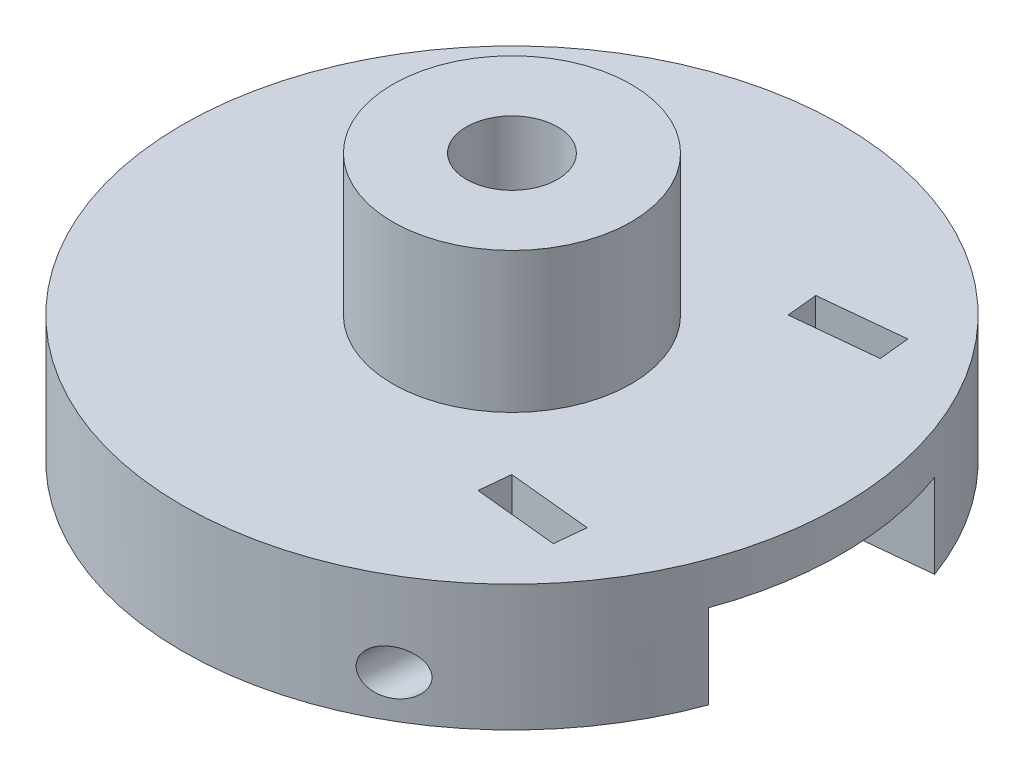
ISO-10303-21;
HEADER;
FILE_DESCRIPTION(('STEP AP214'),'2;1');
FILE_NAME('part.step','',(''),(''),'','','');
FILE_SCHEMA(('AUTOMOTIVE_DESIGN { 1 0 10303 214 1 1 1 1 }'));
ENDSEC;
DATA;
#1=APPLICATION_CONTEXT('core data for automotive mechanical design processes');
#2=APPLICATION_PROTOCOL_DEFINITION('international standard','automotive_design',2000,#1);
#3=PRODUCT_CONTEXT('',#1,'mechanical');
#4=PRODUCT('Part','Part','',(#3));
#5=PRODUCT_RELATED_PRODUCT_CATEGORY('part','',(#4));
#6=PRODUCT_DEFINITION_FORMATION('','',#4);
#7=PRODUCT_DEFINITION_CONTEXT('part definition',#1,'design');
#8=PRODUCT_DEFINITION('design','',#6,#7);
#9=PRODUCT_DEFINITION_SHAPE('','',#8);
#10=(LENGTH_UNIT() NAMED_UNIT(*) SI_UNIT(.MILLI.,.METRE.));
#11=(NAMED_UNIT(*) PLANE_ANGLE_UNIT() SI_UNIT($,.RADIAN.));
#12=(NAMED_UNIT(*) SI_UNIT($,.STERADIAN.) SOLID_ANGLE_UNIT());
#13=UNCERTAINTY_MEASURE_WITH_UNIT(LENGTH_MEASURE(1.E-05),#10,'distance_accuracy_value','');
#14=(GEOMETRIC_REPRESENTATION_CONTEXT(3) GLOBAL_UNCERTAINTY_ASSIGNED_CONTEXT((#13)) GLOBAL_UNIT_ASSIGNED_CONTEXT((#10,
#11,#12)) REPRESENTATION_CONTEXT('',''));
#15=CARTESIAN_POINT('',(0.,0.,0.));
#16=DIRECTION('',(0.,0.,1.));
#17=DIRECTION('',(1.,0.,0.));
#18=AXIS2_PLACEMENT_3D('',#15,#16,#17);
#19=CARTESIAN_POINT('',(0.,3.,0.));
#20=DIRECTION('',(0.,-1.,0.));
#21=DIRECTION('',(0.,0.,-1.));
#22=AXIS2_PLACEMENT_3D('',#19,#20,#21);
#23=CYLINDRICAL_SURFACE('',#22,23.5);
#24=CARTESIAN_POINT('',(13.5222011775975,3.,-19.2197834356316));
#25=CARTESIAN_POINT('',(13.5221980120531,3.07483103153542,-19.2197859059042));
#26=CARTESIAN_POINT('',(13.5164843273736,3.14968338715381,-19.2238094203284));
#27=CARTESIAN_POINT('',(13.4940682696431,3.29689340878573,-19.2395503963883));
#28=CARTESIAN_POINT('',(13.4773582109543,3.36924929270162,-19.2512732392639));
#29=CARTESIAN_POINT('',(13.4342418699253,3.50900694647206,-19.2813853924618));
#30=CARTESIAN_POINT('',(13.4078926114762,3.57643510915319,-19.2997354890764));
#31=CARTESIAN_POINT('',(13.3469422633825,3.70555338273323,-19.3419364574035));
#32=CARTESIAN_POINT('',(13.3123372158487,3.76724072165857,-19.3657899673138));
#33=CARTESIAN_POINT('',(13.2227421340463,3.90506966432966,-19.4271194263085));
#34=CARTESIAN_POINT('',(13.1648814625502,3.97853404739126,-19.4664213022093));
#35=CARTESIAN_POINT('',(13.0396310709168,4.11316767956063,-19.5505432513236));
#36=CARTESIAN_POINT('',(12.9722236279675,4.17431353701327,-19.595373567166));
#37=CARTESIAN_POINT('',(12.8120949412412,4.29833168697844,-19.7005469366235));
#38=CARTESIAN_POINT('',(12.7173062621429,4.35765389980114,-19.761927068992));
#39=CARTESIAN_POINT('',(12.5199685850539,4.45709571930429,-19.887536462409));
#40=CARTESIAN_POINT('',(12.417416112908,4.49720666977237,-19.9517669935749));
#41=CARTESIAN_POINT('',(12.2062526908605,4.55856474508014,-20.0816557410415));
#42=CARTESIAN_POINT('',(12.0975931911652,4.5796278496408,-20.1473217359174));
#43=CARTESIAN_POINT('',(11.8776654414834,4.60186585169948,-20.2777567860175));
#44=CARTESIAN_POINT('',(11.7663961430286,4.60303261403563,-20.3425254635347));
#45=CARTESIAN_POINT('',(11.5358853535261,4.58407912645943,-20.4741838748625));
#46=CARTESIAN_POINT('',(11.4166558097744,4.56239621251844,-20.5408824399028));
#47=CARTESIAN_POINT('',(11.1826629020384,4.49415963803995,-20.6691987775772));
#48=CARTESIAN_POINT('',(11.0678932521617,4.44764245261168,-20.7308238490366));
#49=CARTESIAN_POINT('',(10.877421079741,4.34480600579831,-20.8312287536999));
#50=CARTESIAN_POINT('',(10.7994359553942,4.29436753985028,-20.8717302209751));
#51=CARTESIAN_POINT('',(10.6514261597967,4.17974334143819,-20.9476494317502));
#52=CARTESIAN_POINT('',(10.5813977507641,4.11556410511116,-20.9830695643513));
#53=CARTESIAN_POINT('',(10.4518859832309,3.97358934871259,-21.0478830293301));
#54=CARTESIAN_POINT('',(10.392488578776,3.89569213135531,-21.077227513115));
#55=CARTESIAN_POINT('',(10.2883678347045,3.72838034792822,-21.1282481751348));
#56=CARTESIAN_POINT('',(10.2436312278912,3.63897629752473,-21.1499312878763));
#57=CARTESIAN_POINT('',(10.1768640488557,3.46459605693984,-21.1821298469724));
#58=CARTESIAN_POINT('',(10.1525599181714,3.38069607325822,-21.1937695404374));
#59=CARTESIAN_POINT('',(10.1186429937942,3.20933114518323,-21.2099842151759));
#60=CARTESIAN_POINT('',(10.1090189079939,3.12186899408871,-21.2145646265816));
#61=CARTESIAN_POINT('',(10.1052585413638,2.95563234261322,-21.2163555788096));
#62=CARTESIAN_POINT('',(10.1096235788057,2.87689474292144,-21.2142792587364));
#63=CARTESIAN_POINT('',(10.1303887452489,2.72140998130758,-21.2043711341311));
#64=CARTESIAN_POINT('',(10.1467868506259,2.64466248695226,-21.1965402973469));
#65=CARTESIAN_POINT('',(10.1905210107242,2.49618338573029,-21.1755485023078));
#66=CARTESIAN_POINT('',(10.2177213552963,2.42440205625921,-21.1624536525756));
#67=CARTESIAN_POINT('',(10.2818355084101,2.28647742941954,-21.1313776753956));
#68=CARTESIAN_POINT('',(10.3187513071461,2.22033529090925,-21.1133955467722));
#69=CARTESIAN_POINT('',(10.4036815301208,2.09057273702578,-21.0716822187427));
#70=CARTESIAN_POINT('',(10.4522851048477,2.02743948299099,-21.0476404353167));
#71=CARTESIAN_POINT('',(10.557102883814,1.90990511195087,-20.9952616570003));
#72=CARTESIAN_POINT('',(10.6133202420087,1.85550763419821,-20.9669228815268));
#73=CARTESIAN_POINT('',(10.739210032997,1.74952557108295,-20.9027501514253));
#74=CARTESIAN_POINT('',(10.8096835056405,1.69919484459612,-20.8664210802634));
#75=CARTESIAN_POINT('',(10.9558703118088,1.61040675416156,-20.7900390073905));
#76=CARTESIAN_POINT('',(11.0315865179262,1.57195596348854,-20.7499839599528));
#77=CARTESIAN_POINT('',(11.1988874139172,1.501514902044,-20.6602348675091));
#78=CARTESIAN_POINT('',(11.2910594307316,1.47157217205741,-20.6100290745997));
#79=CARTESIAN_POINT('',(11.4774828075424,1.42702914044929,-20.5067981908008));
#80=CARTESIAN_POINT('',(11.5717352089896,1.41243670966324,-20.453771668212));
#81=CARTESIAN_POINT('',(11.7751179906376,1.39694111646435,-20.3374617788052));
#82=CARTESIAN_POINT('',(11.8842675595839,1.39853867652308,-20.2738722849495));
#83=CARTESIAN_POINT('',(12.1001505110611,1.4209053664837,-20.1457725660885));
#84=CARTESIAN_POINT('',(12.2068810793826,1.44169575870277,-20.0812613980774));
#85=CARTESIAN_POINT('',(12.4249116815316,1.50488719076168,-19.9471648244703));
#86=CARTESIAN_POINT('',(12.5357429270975,1.54908356244745,-19.8776522275385));
#87=CARTESIAN_POINT('',(12.7479628730855,1.65999308287782,-19.7422193163887));
#88=CARTESIAN_POINT('',(12.8493634479151,1.72667741300555,-19.6762945292955));
#89=CARTESIAN_POINT('',(13.0102986676335,1.85977223384235,-19.5700930749087));
#90=CARTESIAN_POINT('',(13.0733642826178,1.92047098660164,-19.527983697724));
#91=CARTESIAN_POINT('',(13.1903361679585,2.05316867833011,-19.4491639495869));
#92=CARTESIAN_POINT('',(13.2442561620898,2.12515036829323,-19.4124455004238));
#93=CARTESIAN_POINT('',(13.3310254590755,2.26500579652732,-19.3529323772489));
#94=CARTESIAN_POINT('',(13.3659322480568,2.3310362230379,-19.3288177968167));
#95=CARTESIAN_POINT('',(13.4262527520051,2.46918448592296,-19.2869668377324));
#96=CARTESIAN_POINT('',(13.4516779807111,2.54129480790879,-19.2692227242168));
#97=CARTESIAN_POINT('',(13.4881234583805,2.67756028491129,-19.2437246251107));
#98=CARTESIAN_POINT('',(13.5008361559049,2.74104398154278,-19.2347999707469));
#99=CARTESIAN_POINT('',(13.5178757456202,2.86967990098326,-19.2228287547821));
#100=CARTESIAN_POINT('',(13.5222039343767,2.93483186423539,-19.2197812843442));
#101=CARTESIAN_POINT('',(13.5222011775975,3.,-19.2197834356316));
#102=B_SPLINE_CURVE_WITH_KNOTS('',3,(#24,#25,#26,#27,#28,#29,#30,#31,#32,#33,#34,#35,#36,#37,
#38,#39,#40,#41,#42,#43,#44,#45,#46,#47,#48,#49,#50,#51,#52,#53,#54,#55,#56,#57,#58,#59,#60,#61,
#62,#63,#64,#65,#66,#67,#68,#69,#70,#71,#72,#73,#74,#75,#76,#77,#78,#79,#80,#81,#82,#83,#84,#85,
#86,#87,#88,#89,#90,#91,#92,#93,#94,#95,#96,#97,#98,#99,#100,#101),.UNSPECIFIED.,.T.,.F.,(4,2,2,
2,2,2,2,2,2,2,2,2,2,2,2,2,2,2,2,2,2,2,2,2,2,2,2,2,2,2,2,2,2,2,2,2,2,2,4),(0.,0.224218629152609,
0.448594136928393,0.671663192612257,0.89483940498668,1.19750369238872,1.50073740156501,
1.88144287518918,2.26231972611965,2.64683807448197,3.03151363988453,3.4443152405295,
3.85651220389316,4.1592788034945,4.46190258087415,4.76687231238662,5.07156529643331,
5.33444256297361,5.59711751828331,5.83262917451993,6.06810123338029,6.30070413705708,
6.53335472618018,6.78202342105378,7.03079544202725,7.31144831541638,7.59225619959714,
7.91843364694605,8.24477825973386,8.62221279436888,9.00006596319255,9.4123234444621,
9.82405460736911,10.1144377133002,10.4043811440437,10.6389210079912,10.8731751285977,
11.0684707146054,11.26373609804),.UNSPECIFIED.);
#103=CARTESIAN_POINT('',(13.5222011775975,3.,-19.2197834356316));
#104=VERTEX_POINT('',#103);
#105=EDGE_CURVE('E185',#104,#104,#102,.T.);
#106=ORIENTED_EDGE('',*,*,#105,.T.);
#107=EDGE_LOOP('',(#106));
#108=FACE_BOUND('',#107,.T.);
#109=DIRECTION('',(0.,-1.,0.));
#110=VECTOR('',#109,1.);
#111=CARTESIAN_POINT('',(22.0752847575931,3.,8.05802723197052));
#112=LINE('',#111,#110);
#113=CARTESIAN_POINT('',(22.0752847575931,6.,8.05802723197052));
#114=VERTEX_POINT('',#113);
#115=CARTESIAN_POINT('',(22.0752847575931,0.,8.05802723197052));
#116=VERTEX_POINT('',#115);
#117=EDGE_CURVE('E271',#114,#116,#112,.T.);
#118=ORIENTED_EDGE('',*,*,#117,.F.);
#119=CARTESIAN_POINT('',(0.,6.,0.));
#120=DIRECTION('',(0.,-1.,0.));
#121=DIRECTION('',(0.,0.,-1.));
#122=AXIS2_PLACEMENT_3D('',#119,#120,#121);
#123=CIRCLE('',#122,23.5);
#124=CARTESIAN_POINT('',(22.0752847575931,6.,-8.05802723197051));
#125=VERTEX_POINT('',#124);
#126=EDGE_CURVE('E216',#125,#114,#123,.T.);
#127=ORIENTED_EDGE('',*,*,#126,.F.);
#128=DIRECTION('',(0.,-1.,0.));
#129=VECTOR('',#128,1.);
#130=CARTESIAN_POINT('',(22.0752847575931,3.,-8.05802723197051));
#131=LINE('',#130,#129);
#132=CARTESIAN_POINT('',(22.0752847575931,0.,-8.05802723197051));
#133=VERTEX_POINT('',#132);
#134=EDGE_CURVE('E286',#125,#133,#131,.T.);
#135=ORIENTED_EDGE('',*,*,#134,.T.);
#136=CARTESIAN_POINT('',(0.,0.,0.));
#137=DIRECTION('',(0.,1.,0.));
#138=DIRECTION('',(0.,0.,1.));
#139=AXIS2_PLACEMENT_3D('',#136,#137,#138);
#140=CIRCLE('',#139,23.5);
#141=EDGE_CURVE('E247',#133,#116,#140,.T.);
#142=ORIENTED_EDGE('',*,*,#141,.T.);
#143=EDGE_LOOP('',(#118,#127,#135,#142));
#144=FACE_BOUND('',#143,.T.);
#145=CARTESIAN_POINT('',(0.,9.,0.));
#146=DIRECTION('',(0.,1.,0.));
#147=DIRECTION('',(0.,0.,1.));
#148=AXIS2_PLACEMENT_3D('',#145,#146,#147);
#149=CIRCLE('',#148,23.5);
#150=CARTESIAN_POINT('',(0.,9.,23.5));
#151=VERTEX_POINT('',#150);
#152=EDGE_CURVE('E241',#151,#151,#149,.T.);
#153=ORIENTED_EDGE('',*,*,#152,.F.);
#154=EDGE_LOOP('',(#153));
#155=FACE_BOUND('',#154,.T.);
#156=CARTESIAN_POINT('',(10.1066500326608,3.,21.2156928974125));
#157=CARTESIAN_POINT('',(10.1066596206851,2.92001526048397,21.2156890064881));
#158=CARTESIAN_POINT('',(10.113022143271,2.83991124722057,21.2126610681218));
#159=CARTESIAN_POINT('',(10.1381783155469,2.68201126766179,21.200649107959));
#160=CARTESIAN_POINT('',(10.1570033579199,2.60422164966788,21.1916500449626));
#161=CARTESIAN_POINT('',(10.2060349567702,2.45354127886759,21.1680793055541));
#162=CARTESIAN_POINT('',(10.2362003542757,2.3806339203224,21.1535277785671));
#163=CARTESIAN_POINT('',(10.3065004105874,2.24116844007799,21.119364780268));
#164=CARTESIAN_POINT('',(10.3466314433062,2.17460802115156,21.0997551492931));
#165=CARTESIAN_POINT('',(10.4374576455816,2.04587145103915,21.0549794116021));
#166=CARTESIAN_POINT('',(10.4885775136472,1.98407558528717,21.0295862503547));
#167=CARTESIAN_POINT('',(10.5981523116231,1.86955512572515,20.9745781298752));
#168=CARTESIAN_POINT('',(10.6566106488958,1.81683477295369,20.9449612086125));
#169=CARTESIAN_POINT('',(10.7873784867031,1.71436990699722,20.8779441492551));
#170=CARTESIAN_POINT('',(10.860492395863,1.6659888074044,20.840033055846));
#171=CARTESIAN_POINT('',(11.0116381943955,1.58149356363988,20.7605667410307));
#172=CARTESIAN_POINT('',(11.0896728723233,1.54538645044712,20.7190094480399));
#173=CARTESIAN_POINT('',(11.2617596426314,1.48032015210923,20.626046788733));
#174=CARTESIAN_POINT('',(11.3563467925582,1.45349037586628,20.5741412958097));
#175=CARTESIAN_POINT('',(11.5471434640614,1.41561325564686,20.4676682901979));
#176=CARTESIAN_POINT('',(11.6433537651749,1.40457372682014,20.4130994731435));
#177=CARTESIAN_POINT('',(11.8500481797417,1.39721173613163,20.2939065787517));
#178=CARTESIAN_POINT('',(11.9604728984469,1.40338875660012,20.2290175547076));
#179=CARTESIAN_POINT('',(12.1782441564667,1.43538070797875,20.0986694483679));
#180=CARTESIAN_POINT('',(12.2855868030733,1.46121942947825,20.0332097705113));
#181=CARTESIAN_POINT('',(12.5026708734831,1.53506707666085,19.8985115794719));
#182=CARTESIAN_POINT('',(12.6119487447357,1.58464501684839,19.82937549123));
#183=CARTESIAN_POINT('',(12.8200355956084,1.70651120267432,19.695479634954));
#184=CARTESIAN_POINT('',(12.918862180801,1.77876041589417,19.6307125760155));
#185=CARTESIAN_POINT('',(13.0715311594699,1.91902472602139,19.5292242590454));
#186=CARTESIAN_POINT('',(13.129576852574,1.98083359559236,19.4902130722104));
#187=CARTESIAN_POINT('',(13.2364941564236,2.11478945726003,19.4177591136253));
#188=CARTESIAN_POINT('',(13.2853803130267,2.18691973146527,19.3843075226364));
#189=CARTESIAN_POINT('',(13.3637114115076,2.32696455738424,19.330366577111));
#190=CARTESIAN_POINT('',(13.3950700177297,2.39332205950562,19.3086287801433));
#191=CARTESIAN_POINT('',(13.4482916295975,2.5314636292572,19.2715984802951));
#192=CARTESIAN_POINT('',(13.4701599819397,2.60324461452608,19.2563023484013));
#193=CARTESIAN_POINT('',(13.5030697719909,2.75093590402418,19.2332400857966));
#194=CARTESIAN_POINT('',(13.5140440564513,2.82686881269362,19.2255206627018));
#195=CARTESIAN_POINT('',(13.5240457006154,2.97990017898132,19.2184867023487));
#196=CARTESIAN_POINT('',(13.5230778902018,3.05699815279854,19.2191687671772));
#197=CARTESIAN_POINT('',(13.5100093864646,3.20172640134352,19.2283564544404));
#198=CARTESIAN_POINT('',(13.4990584320354,3.26951796990707,19.2360540853458));
#199=CARTESIAN_POINT('',(13.4683229763311,3.40202858370362,19.2575861684079));
#200=CARTESIAN_POINT('',(13.4485375440477,3.46674730431361,19.2714212673514));
#201=CARTESIAN_POINT('',(13.400213056304,3.59438182116444,19.3050559172674));
#202=CARTESIAN_POINT('',(13.3713470255297,3.65711357029571,19.3250776588803));
#203=CARTESIAN_POINT('',(13.3064995245465,3.77696731627098,19.3697863860376));
#204=CARTESIAN_POINT('',(13.2705131048183,3.83408536935554,19.3944766162053));
#205=CARTESIAN_POINT('',(13.1745905443979,3.96735297977473,19.459827521351));
#206=CARTESIAN_POINT('',(13.1112832341051,4.04005831097235,19.5025873553785));
#207=CARTESIAN_POINT('',(12.9752370247248,4.17213588398953,19.593364619898));
#208=CARTESIAN_POINT('',(12.9024825875604,4.23148570996125,19.6413906912866));
#209=CARTESIAN_POINT('',(12.7487790027911,4.3377394888014,19.7415089067483));
#210=CARTESIAN_POINT('',(12.6677179214348,4.38443047273176,19.7936535732468));
#211=CARTESIAN_POINT('',(12.500379528208,4.46423756438954,19.8997573504992));
#212=CARTESIAN_POINT('',(12.414103349664,4.497356609439,19.9537160659071));
#213=CARTESIAN_POINT('',(12.2188616050059,4.55575916669666,20.0739933446331));
#214=CARTESIAN_POINT('',(12.1090145932496,4.57781388454035,20.1404685240602));
#215=CARTESIAN_POINT('',(11.8864928512322,4.60157546970685,20.2725939996571));
#216=CARTESIAN_POINT('',(11.7738148646627,4.60325771890807,20.338243202086));
#217=CARTESIAN_POINT('',(11.5418355615462,4.58495576828542,20.4708305718348));
#218=CARTESIAN_POINT('',(11.422540851695,4.56367072650159,20.5376113033229));
#219=CARTESIAN_POINT('',(11.1883680162369,4.49624218233628,20.6661118341097));
#220=CARTESIAN_POINT('',(11.0734828186445,4.45014043285303,20.7278399338299));
#221=CARTESIAN_POINT('',(10.8825838303911,4.34795444768724,20.8285334499888));
#222=CARTESIAN_POINT('',(10.8043198323822,4.29772625957088,20.8692038447378));
#223=CARTESIAN_POINT('',(10.6557176799672,4.18346417246775,20.9454681017118));
#224=CARTESIAN_POINT('',(10.5853760557341,4.11943635350096,20.9810641882024));
#225=CARTESIAN_POINT('',(10.4552157163836,3.97770515447492,21.0462304955525));
#226=CARTESIAN_POINT('',(10.3954824552351,3.89989998786941,21.0757520611772));
#227=CARTESIAN_POINT('',(10.2906776710473,3.73266305799192,21.1271243725162));
#228=CARTESIAN_POINT('',(10.2455938734444,3.64324111664787,21.1489815413345));
#229=CARTESIAN_POINT('',(10.1815233268915,3.47739692112737,21.1798852970892));
#230=CARTESIAN_POINT('',(10.1589257006316,3.40268144606029,21.1907187264617));
#231=CARTESIAN_POINT('',(10.1254168835339,3.25022438680251,21.2067510793465));
#232=CARTESIAN_POINT('',(10.1144717579537,3.17249227681174,21.2119663647057));
#233=CARTESIAN_POINT('',(10.1076278493564,3.0629827776036,21.2152269187387));
#234=CARTESIAN_POINT('',(10.1066462565793,3.0315006387504,21.2156944297873));
#235=CARTESIAN_POINT('',(10.1066500326608,3.,21.2156928974125));
#236=B_SPLINE_CURVE_WITH_KNOTS('',3,(#156,#157,#158,#159,#160,#161,#162,#163,#164,#165,#166,
#167,#168,#169,#170,#171,#172,#173,#174,#175,#176,#177,#178,#179,#180,#181,#182,#183,#184,#185,
#186,#187,#188,#189,#190,#191,#192,#193,#194,#195,#196,#197,#198,#199,#200,#201,#202,#203,#204,
#205,#206,#207,#208,#209,#210,#211,#212,#213,#214,#215,#216,#217,#218,#219,#220,#221,#222,#223,
#224,#225,#226,#227,#228,#229,#230,#231,#232,#233,#234,#235),.UNSPECIFIED.,.T.,.F.,(4,2,2,2,2,2,
2,2,2,2,2,2,2,2,2,2,2,2,2,2,2,2,2,2,2,2,2,2,2,2,2,2,2,2,2,2,2,2,2,4),(0.,0.239858132738747,
0.480322771054226,0.719922957090264,0.959436089822438,1.21080893120962,1.46229892353484,
1.74775243729408,2.03336919457755,2.36561642835766,2.69802804616547,3.08110286898564,
3.46464194951312,3.87803242189458,4.29071504213131,4.56975007103254,4.84833814957313,
5.07705202849147,5.3056368849151,5.53562219426412,5.76551449098538,5.97187426764278,
6.17825579635414,6.39313765465092,6.60816940955738,6.92283368436173,7.2380222158833,
7.55822390145191,7.8783562503664,8.26750868484173,8.65713132484391,9.07003865516873,
9.48225345047408,9.78555273109924,10.0887186523888,10.3942256638528,10.6994760315652,
10.9348860009517,11.1696085115447,11.2640725860227),.UNSPECIFIED.);
#237=CARTESIAN_POINT('',(10.1066500326608,3.,21.2156928974125));
#238=VERTEX_POINT('',#237);
#239=EDGE_CURVE('E326',#238,#238,#236,.T.);
#240=ORIENTED_EDGE('',*,*,#239,.F.);
#241=EDGE_LOOP('',(#240));
#242=FACE_BOUND('',#241,.T.);
#243=ADVANCED_FACE('F38',(#108,#144,#155,#242),#23,.T.);
#244=CARTESIAN_POINT('',(0.,0.,0.));
#245=DIRECTION('',(0.,1.,0.));
#246=DIRECTION('',(0.,0.,1.));
#247=AXIS2_PLACEMENT_3D('',#244,#245,#246);
#248=CYLINDRICAL_SURFACE('',#247,3.25);
#249=CARTESIAN_POINT('',(0.,19.,0.));
#250=DIRECTION('',(0.,1.,0.));
#251=DIRECTION('',(0.,0.,1.));
#252=AXIS2_PLACEMENT_3D('',#249,#250,#251);
#253=CIRCLE('',#252,3.25);
#254=CARTESIAN_POINT('',(0.,19.,3.25));
#255=VERTEX_POINT('',#254);
#256=EDGE_CURVE('E233',#255,#255,#253,.T.);
#257=ORIENTED_EDGE('',*,*,#256,.T.);
#258=EDGE_LOOP('',(#257));
#259=FACE_BOUND('',#258,.T.);
#260=CARTESIAN_POINT('',(0.,6.,0.));
#261=DIRECTION('',(0.,-1.,0.));
#262=DIRECTION('',(0.,0.,-1.));
#263=AXIS2_PLACEMENT_3D('',#260,#261,#262);
#264=CIRCLE('',#263,3.25);
#265=CARTESIAN_POINT('',(0.,6.,-3.25));
#266=VERTEX_POINT('',#265);
#267=EDGE_CURVE('E232',#266,#266,#264,.F.);
#268=ORIENTED_EDGE('',*,*,#267,.F.);
#269=EDGE_LOOP('',(#268));
#270=FACE_BOUND('',#269,.T.);
#271=ADVANCED_FACE('F387',(#259,#270),#248,.F.);
#272=CARTESIAN_POINT('',(0.,0.,0.));
#273=DIRECTION('',(0.,1.,0.));
#274=DIRECTION('',(0.,0.,1.));
#275=AXIS2_PLACEMENT_3D('',#272,#273,#274);
#276=PLANE('',#275);
#277=DIRECTION('',(0.995037190209989,0.,0.099503719021001));
#278=VECTOR('',#277,1.);
#279=CARTESIAN_POINT('',(9.83632731801023,0.,9.84909417434851));
#280=LINE('',#279,#278);
#281=CARTESIAN_POINT('',(9.83632731801023,0.,9.84909417434851));
#282=VERTEX_POINT('',#281);
#283=CARTESIAN_POINT('',(15.8065504592702,0.,10.4461164884745));
#284=VERTEX_POINT('',#283);
#285=EDGE_CURVE('E159',#282,#284,#280,.T.);
#286=ORIENTED_EDGE('',*,*,#285,.F.);
#287=DIRECTION('',(0.0995037190209992,0.,-0.995037190209989));
#288=VECTOR('',#287,1.);
#289=CARTESIAN_POINT('',(9.61741913616403,0.,12.0381759928105));
#290=LINE('',#289,#288);
#291=CARTESIAN_POINT('',(9.61741913616403,0.,12.0381759928105));
#292=VERTEX_POINT('',#291);
#293=EDGE_CURVE('E56',#292,#282,#290,.T.);
#294=ORIENTED_EDGE('',*,*,#293,.F.);
#295=DIRECTION('',(-0.995037190209989,0.,-0.0995037190209989));
#296=VECTOR('',#295,1.);
#297=CARTESIAN_POINT('',(15.587642277424,0.,12.6351983069365));
#298=LINE('',#297,#296);
#299=CARTESIAN_POINT('',(15.587642277424,0.,12.6351983069365));
#300=VERTEX_POINT('',#299);
#301=EDGE_CURVE('E167',#300,#292,#298,.T.);
#302=ORIENTED_EDGE('',*,*,#301,.F.);
#303=DIRECTION('',(-0.0995037190209973,0.,0.995037190209989));
#304=VECTOR('',#303,1.);
#305=CARTESIAN_POINT('',(15.8065504592702,0.,10.4461164884745));
#306=LINE('',#305,#304);
#307=EDGE_CURVE('E148',#284,#300,#306,.T.);
#308=ORIENTED_EDGE('',*,*,#307,.F.);
#309=EDGE_LOOP('',(#286,#294,#302,#308));
#310=FACE_BOUND('',#309,.T.);
#311=DIRECTION('',(0.0995037190209968,0.,0.995037190209989));
#312=VECTOR('',#311,1.);
#313=CARTESIAN_POINT('',(15.8065504592702,0.,-10.4461164884745));
#314=LINE('',#313,#312);
#315=CARTESIAN_POINT('',(15.587642277424,0.,-12.6351983069365));
#316=VERTEX_POINT('',#315);
#317=CARTESIAN_POINT('',(15.8065504592702,0.,-10.4461164884745));
#318=VERTEX_POINT('',#317);
#319=EDGE_CURVE('E184',#316,#318,#314,.T.);
#320=ORIENTED_EDGE('',*,*,#319,.F.);
#321=DIRECTION('',(0.995037190209989,0.,-0.0995037190209989));
#322=VECTOR('',#321,1.);
#323=CARTESIAN_POINT('',(15.587642277424,0.,-12.6351983069365));
#324=LINE('',#323,#322);
#325=CARTESIAN_POINT('',(9.61741913616403,0.,-12.0381759928105));
#326=VERTEX_POINT('',#325);
#327=EDGE_CURVE('E64',#326,#316,#324,.T.);
#328=ORIENTED_EDGE('',*,*,#327,.F.);
#329=DIRECTION('',(-0.0995037190209992,0.,-0.995037190209989));
#330=VECTOR('',#329,1.);
#331=CARTESIAN_POINT('',(9.61741913616403,0.,-12.0381759928105));
#332=LINE('',#331,#330);
#333=CARTESIAN_POINT('',(9.83632731801023,0.,-9.84909417434851));
#334=VERTEX_POINT('',#333);
#335=EDGE_CURVE('E193',#334,#326,#332,.T.);
#336=ORIENTED_EDGE('',*,*,#335,.F.);
#337=DIRECTION('',(-0.995037190209989,0.,0.099503719020999));
#338=VECTOR('',#337,1.);
#339=CARTESIAN_POINT('',(9.83632731801023,0.,-9.84909417434851));
#340=LINE('',#339,#338);
#341=EDGE_CURVE('E189',#318,#334,#340,.T.);
#342=ORIENTED_EDGE('',*,*,#341,.F.);
#343=EDGE_LOOP('',(#320,#328,#336,#342));
#344=FACE_BOUND('',#343,.T.);
#345=DIRECTION('',(-0.995037190209989,0.,0.0995037190209987));
#346=VECTOR('',#345,1.);
#347=CARTESIAN_POINT('',(-0.579257302595168,0.,-5.79257302595169));
#348=LINE('',#347,#346);
#349=CARTESIAN_POINT('',(-15.7089578099441,0.,-4.2796029752168));
#350=VERTEX_POINT('',#349);
#351=EDGE_CURVE('E251',#133,#350,#348,.T.);
#352=ORIENTED_EDGE('',*,*,#351,.T.);
#353=CARTESIAN_POINT('',(-15.5,0.,-2.19002487577582));
#354=DIRECTION('',(0.,1.,0.));
#355=DIRECTION('',(0.,0.,1.));
#356=AXIS2_PLACEMENT_3D('',#353,#354,#355);
#357=CIRCLE('',#356,2.10000000000001);
#358=CARTESIAN_POINT('',(-17.6,0.,-2.19002487577583));
#359=VERTEX_POINT('',#358);
#360=EDGE_CURVE('E255',#350,#359,#357,.T.);
#361=ORIENTED_EDGE('',*,*,#360,.T.);
#362=DIRECTION('',(0.,0.,1.));
#363=VECTOR('',#362,1.);
#364=CARTESIAN_POINT('',(-17.6,0.,0.));
#365=LINE('',#364,#363);
#366=CARTESIAN_POINT('',(-17.6,0.,2.19002487577582));
#367=VERTEX_POINT('',#366);
#368=EDGE_CURVE('E259',#359,#367,#365,.T.);
#369=ORIENTED_EDGE('',*,*,#368,.T.);
#370=CARTESIAN_POINT('',(-15.5,0.,2.19002487577583));
#371=DIRECTION('',(0.,1.,0.));
#372=DIRECTION('',(0.,0.,1.));
#373=AXIS2_PLACEMENT_3D('',#370,#371,#372);
#374=CIRCLE('',#373,2.1);
#375=CARTESIAN_POINT('',(-15.7089578099441,0.,4.27960297521681));
#376=VERTEX_POINT('',#375);
#377=EDGE_CURVE('E263',#367,#376,#374,.T.);
#378=ORIENTED_EDGE('',*,*,#377,.T.);
#379=DIRECTION('',(0.995037190209989,0.,0.0995037190209988));
#380=VECTOR('',#379,1.);
#381=CARTESIAN_POINT('',(-0.579257302595169,0.,5.7925730259517));
#382=LINE('',#381,#380);
#383=EDGE_CURVE('E267',#376,#116,#382,.T.);
#384=ORIENTED_EDGE('',*,*,#383,.T.);
#385=ORIENTED_EDGE('',*,*,#141,.F.);
#386=EDGE_LOOP('',(#352,#361,#369,#378,#384,#385));
#387=FACE_BOUND('',#386,.T.);
#388=ADVANCED_FACE('F164',(#310,#344,#387),#276,.F.);
#389=CARTESIAN_POINT('',(-0.579257302595168,3.,-5.79257302595169));
#390=DIRECTION('',(0.0995037190209987,0.,0.995037190209989));
#391=DIRECTION('',(0.995037190209989,0.,-0.0995037190209987));
#392=AXIS2_PLACEMENT_3D('',#389,#390,#391);
#393=PLANE('',#392);
#394=CARTESIAN_POINT('',(13.1199500457032,3.,-7.16249376078153));
#395=DIRECTION('',(0.0995037190209987,0.,0.995037190209989));
#396=DIRECTION('',(0.995037190209989,0.,-0.0995037190209987));
#397=AXIS2_PLACEMENT_3D('',#394,#395,#396);
#398=CIRCLE('',#397,1.6);
#399=CARTESIAN_POINT('',(14.7120095500392,3.,-7.32169971121513));
#400=VERTEX_POINT('',#399);
#401=EDGE_CURVE('E318',#400,#400,#398,.T.);
#402=ORIENTED_EDGE('',*,*,#401,.F.);
#403=EDGE_LOOP('',(#402));
#404=FACE_BOUND('',#403,.T.);
#405=ORIENTED_EDGE('',*,*,#351,.F.);
#406=ORIENTED_EDGE('',*,*,#134,.F.);
#407=DIRECTION('',(0.995037190209989,0.,-0.0995037190209987));
#408=VECTOR('',#407,1.);
#409=CARTESIAN_POINT('',(-15.7089578099441,6.,-4.2796029752168));
#410=LINE('',#409,#408);
#411=CARTESIAN_POINT('',(-15.7089578099441,6.,-4.2796029752168));
#412=VERTEX_POINT('',#411);
#413=EDGE_CURVE('E212',#412,#125,#410,.T.);
#414=ORIENTED_EDGE('',*,*,#413,.F.);
#415=DIRECTION('',(0.,-1.,0.));
#416=VECTOR('',#415,1.);
#417=CARTESIAN_POINT('',(-15.7089578099441,3.,-4.2796029752168));
#418=LINE('',#417,#416);
#419=EDGE_CURVE('E283',#412,#350,#418,.T.);
#420=ORIENTED_EDGE('',*,*,#419,.T.);
#421=EDGE_LOOP('',(#405,#406,#414,#420));
#422=FACE_BOUND('',#421,.T.);
#423=ADVANCED_FACE('F417',(#404,#422),#393,.T.);
#424=CARTESIAN_POINT('',(-15.5,3.,-2.19002487577582));
#425=DIRECTION('',(0.,-1.,0.));
#426=DIRECTION('',(0.,0.,-1.));
#427=AXIS2_PLACEMENT_3D('',#424,#425,#426);
#428=CYLINDRICAL_SURFACE('',#427,2.10000000000001);
#429=ORIENTED_EDGE('',*,*,#360,.F.);
#430=ORIENTED_EDGE('',*,*,#419,.F.);
#431=CARTESIAN_POINT('',(-15.5,6.,-2.19002487577582));
#432=DIRECTION('',(0.,-1.,0.));
#433=DIRECTION('',(0.,0.,-1.));
#434=AXIS2_PLACEMENT_3D('',#431,#432,#433);
#435=CIRCLE('',#434,2.10000000000001);
#436=CARTESIAN_POINT('',(-17.6,6.,-2.19002487577583));
#437=VERTEX_POINT('',#436);
#438=EDGE_CURVE('E177',#437,#412,#435,.T.);
#439=ORIENTED_EDGE('',*,*,#438,.F.);
#440=DIRECTION('',(0.,-1.,0.));
#441=VECTOR('',#440,1.);
#442=CARTESIAN_POINT('',(-17.6,3.,-2.19002487577583));
#443=LINE('',#442,#441);
#444=EDGE_CURVE('E280',#437,#359,#443,.T.);
#445=ORIENTED_EDGE('',*,*,#444,.T.);
#446=EDGE_LOOP('',(#429,#430,#439,#445));
#447=FACE_BOUND('',#446,.T.);
#448=ADVANCED_FACE('F413',(#447),#428,.F.);
#449=CARTESIAN_POINT('',(-17.6,3.,0.));
#450=DIRECTION('',(1.,0.,0.));
#451=DIRECTION('',(0.,0.,-1.));
#452=AXIS2_PLACEMENT_3D('',#449,#450,#451);
#453=PLANE('',#452);
#454=ORIENTED_EDGE('',*,*,#368,.F.);
#455=ORIENTED_EDGE('',*,*,#444,.F.);
#456=DIRECTION('',(0.,0.,-1.));
#457=VECTOR('',#456,1.);
#458=CARTESIAN_POINT('',(-17.6,6.,2.19002487577582));
#459=LINE('',#458,#457);
#460=CARTESIAN_POINT('',(-17.6,6.,2.19002487577582));
#461=VERTEX_POINT('',#460);
#462=EDGE_CURVE('E228',#461,#437,#459,.T.);
#463=ORIENTED_EDGE('',*,*,#462,.F.);
#464=DIRECTION('',(0.,-1.,0.));
#465=VECTOR('',#464,1.);
#466=CARTESIAN_POINT('',(-17.6,3.,2.19002487577582));
#467=LINE('',#466,#465);
#468=EDGE_CURVE('E277',#461,#367,#467,.T.);
#469=ORIENTED_EDGE('',*,*,#468,.T.);
#470=EDGE_LOOP('',(#454,#455,#463,#469));
#471=FACE_BOUND('',#470,.T.);
#472=ADVANCED_FACE('F409',(#471),#453,.T.);
#473=CARTESIAN_POINT('',(-15.5,3.,2.19002487577583));
#474=DIRECTION('',(0.,-1.,0.));
#475=DIRECTION('',(0.,0.,-1.));
#476=AXIS2_PLACEMENT_3D('',#473,#474,#475);
#477=CYLINDRICAL_SURFACE('',#476,2.1);
#478=ORIENTED_EDGE('',*,*,#377,.F.);
#479=ORIENTED_EDGE('',*,*,#468,.F.);
#480=CARTESIAN_POINT('',(-15.5,6.,2.19002487577583));
#481=DIRECTION('',(0.,-1.,0.));
#482=DIRECTION('',(0.,0.,-1.));
#483=AXIS2_PLACEMENT_3D('',#480,#481,#482);
#484=CIRCLE('',#483,2.1);
#485=CARTESIAN_POINT('',(-15.7089578099441,6.,4.27960297521681));
#486=VERTEX_POINT('',#485);
#487=EDGE_CURVE('E224',#486,#461,#484,.T.);
#488=ORIENTED_EDGE('',*,*,#487,.F.);
#489=DIRECTION('',(0.,-1.,0.));
#490=VECTOR('',#489,1.);
#491=CARTESIAN_POINT('',(-15.7089578099441,3.,4.27960297521681));
#492=LINE('',#491,#490);
#493=EDGE_CURVE('E274',#486,#376,#492,.T.);
#494=ORIENTED_EDGE('',*,*,#493,.T.);
#495=EDGE_LOOP('',(#478,#479,#488,#494));
#496=FACE_BOUND('',#495,.T.);
#497=ADVANCED_FACE('F405',(#496),#477,.F.);
#498=CARTESIAN_POINT('',(-0.579257302595169,3.,5.7925730259517));
#499=DIRECTION('',(0.0995037190209988,0.,-0.995037190209989));
#500=DIRECTION('',(-0.995037190209989,0.,-0.0995037190209988));
#501=AXIS2_PLACEMENT_3D('',#498,#499,#500);
#502=PLANE('',#501);
#503=CARTESIAN_POINT('',(13.1199500457032,3.,7.16249376078153));
#504=DIRECTION('',(-0.0995037190209987,0.,0.995037190209989));
#505=DIRECTION('',(0.995037190209989,0.,0.0995037190209987));
#506=AXIS2_PLACEMENT_3D('',#503,#504,#505);
#507=CIRCLE('',#506,1.6);
#508=CARTESIAN_POINT('',(14.7120095500392,3.,7.32169971121513));
#509=VERTEX_POINT('',#508);
#510=EDGE_CURVE('E450',#509,#509,#507,.T.);
#511=ORIENTED_EDGE('',*,*,#510,.T.);
#512=EDGE_LOOP('',(#511));
#513=FACE_BOUND('',#512,.T.);
#514=ORIENTED_EDGE('',*,*,#383,.F.);
#515=ORIENTED_EDGE('',*,*,#493,.F.);
#516=DIRECTION('',(-0.995037190209989,0.,-0.0995037190209988));
#517=VECTOR('',#516,1.);
#518=CARTESIAN_POINT('',(22.0752847575931,6.,8.05802723197052));
#519=LINE('',#518,#517);
#520=EDGE_CURVE('E220',#114,#486,#519,.T.);
#521=ORIENTED_EDGE('',*,*,#520,.F.);
#522=ORIENTED_EDGE('',*,*,#117,.T.);
#523=EDGE_LOOP('',(#514,#515,#521,#522));
#524=FACE_BOUND('',#523,.T.);
#525=ADVANCED_FACE('F401',(#513,#524),#502,.T.);
#526=CARTESIAN_POINT('',(0.,9.,0.));
#527=DIRECTION('',(0.,1.,0.));
#528=DIRECTION('',(0.,0.,1.));
#529=AXIS2_PLACEMENT_3D('',#526,#527,#528);
#530=PLANE('',#529);
#531=DIRECTION('',(-0.0995037190209992,0.,0.995037190209989));
#532=VECTOR('',#531,1.);
#533=CARTESIAN_POINT('',(10.7140957776684,9.,1.07140957776684));
#534=LINE('',#533,#532);
#535=CARTESIAN_POINT('',(9.83632731801023,9.,9.84909417434851));
#536=VERTEX_POINT('',#535);
#537=CARTESIAN_POINT('',(9.61741913616403,9.,12.0381759928105));
#538=VERTEX_POINT('',#537);
#539=EDGE_CURVE('E11',#536,#538,#534,.T.);
#540=ORIENTED_EDGE('',*,*,#539,.F.);
#541=DIRECTION('',(-0.995037190209989,0.,-0.099503719021001));
#542=VECTOR('',#541,1.);
#543=CARTESIAN_POINT('',(-0.877768459658183,9.,8.77768459658165));
#544=LINE('',#543,#542);
#545=CARTESIAN_POINT('',(15.8065504592702,9.,10.4461164884745));
#546=VERTEX_POINT('',#545);
#547=EDGE_CURVE('E308',#546,#536,#544,.T.);
#548=ORIENTED_EDGE('',*,*,#547,.F.);
#549=DIRECTION('',(0.0995037190209974,0.,-0.995037190209989));
#550=VECTOR('',#549,1.);
#551=CARTESIAN_POINT('',(16.6843189189283,9.,1.66843189189281));
#552=LINE('',#551,#550);
#553=CARTESIAN_POINT('',(15.587642277424,9.,12.6351983069365));
#554=VERTEX_POINT('',#553);
#555=EDGE_CURVE('E151',#554,#546,#552,.T.);
#556=ORIENTED_EDGE('',*,*,#555,.F.);
#557=DIRECTION('',(0.995037190209989,0.,0.0995037190209989));
#558=VECTOR('',#557,1.);
#559=CARTESIAN_POINT('',(-1.09667664150436,9.,10.9667664150436));
#560=LINE('',#559,#558);
#561=EDGE_CURVE('E48',#538,#554,#560,.T.);
#562=ORIENTED_EDGE('',*,*,#561,.F.);
#563=EDGE_LOOP('',(#540,#548,#556,#562));
#564=FACE_BOUND('',#563,.T.);
#565=DIRECTION('',(-0.995037190209989,0.,0.0995037190209989));
#566=VECTOR('',#565,1.);
#567=CARTESIAN_POINT('',(-1.09667664150436,9.,-10.9667664150436));
#568=LINE('',#567,#566);
#569=CARTESIAN_POINT('',(15.587642277424,9.,-12.6351983069365));
#570=VERTEX_POINT('',#569);
#571=CARTESIAN_POINT('',(9.61741913616403,9.,-12.0381759928105));
#572=VERTEX_POINT('',#571);
#573=EDGE_CURVE('E305',#570,#572,#568,.T.);
#574=ORIENTED_EDGE('',*,*,#573,.F.);
#575=DIRECTION('',(-0.0995037190209968,0.,-0.995037190209989));
#576=VECTOR('',#575,1.);
#577=CARTESIAN_POINT('',(16.6843189189283,9.,-1.6684318918928));
#578=LINE('',#577,#576);
#579=CARTESIAN_POINT('',(15.8065504592702,9.,-10.4461164884745));
#580=VERTEX_POINT('',#579);
#581=EDGE_CURVE('E246',#580,#570,#578,.T.);
#582=ORIENTED_EDGE('',*,*,#581,.F.);
#583=DIRECTION('',(0.995037190209989,0.,-0.099503719020999));
#584=VECTOR('',#583,1.);
#585=CARTESIAN_POINT('',(-0.877768459658167,9.,-8.77768459658167));
#586=LINE('',#585,#584);
#587=CARTESIAN_POINT('',(9.83632731801023,9.,-9.84909417434851));
#588=VERTEX_POINT('',#587);
#589=EDGE_CURVE('E298',#588,#580,#586,.T.);
#590=ORIENTED_EDGE('',*,*,#589,.F.);
#591=DIRECTION('',(0.0995037190209992,0.,0.995037190209989));
#592=VECTOR('',#591,1.);
#593=CARTESIAN_POINT('',(10.7140957776684,9.,-1.07140957776684));
#594=LINE('',#593,#592);
#595=EDGE_CURVE('E302',#572,#588,#594,.T.);
#596=ORIENTED_EDGE('',*,*,#595,.F.);
#597=EDGE_LOOP('',(#574,#582,#590,#596));
#598=FACE_BOUND('',#597,.T.);
#599=CARTESIAN_POINT('',(0.,9.,0.));
#600=DIRECTION('',(0.,1.,0.));
#601=DIRECTION('',(0.,0.,1.));
#602=AXIS2_PLACEMENT_3D('',#599,#600,#601);
#603=CIRCLE('',#602,8.5);
#604=CARTESIAN_POINT('',(0.,9.,8.5));
#605=VERTEX_POINT('',#604);
#606=EDGE_CURVE('E242',#605,#605,#603,.T.);
#607=ORIENTED_EDGE('',*,*,#606,.F.);
#608=EDGE_LOOP('',(#607));
#609=FACE_BOUND('',#608,.T.);
#610=ORIENTED_EDGE('',*,*,#152,.T.);
#611=EDGE_LOOP('',(#610));
#612=FACE_BOUND('',#611,.T.);
#613=ADVANCED_FACE('F397',(#564,#598,#609,#612),#530,.T.);
#614=CARTESIAN_POINT('',(0.,19.,0.));
#615=DIRECTION('',(0.,-1.,0.));
#616=DIRECTION('',(0.,0.,-1.));
#617=AXIS2_PLACEMENT_3D('',#614,#615,#616);
#618=CYLINDRICAL_SURFACE('',#617,8.5);
#619=CARTESIAN_POINT('',(0.,19.,0.));
#620=DIRECTION('',(0.,1.,0.));
#621=DIRECTION('',(0.,0.,1.));
#622=AXIS2_PLACEMENT_3D('',#619,#620,#621);
#623=CIRCLE('',#622,8.5);
#624=CARTESIAN_POINT('',(0.,19.,8.5));
#625=VERTEX_POINT('',#624);
#626=EDGE_CURVE('E237',#625,#625,#623,.T.);
#627=ORIENTED_EDGE('',*,*,#626,.F.);
#628=EDGE_LOOP('',(#627));
#629=FACE_BOUND('',#628,.T.);
#630=ORIENTED_EDGE('',*,*,#606,.T.);
#631=EDGE_LOOP('',(#630));
#632=FACE_BOUND('',#631,.T.);
#633=ADVANCED_FACE('F393',(#629,#632),#618,.T.);
#634=CARTESIAN_POINT('',(0.,19.,0.));
#635=DIRECTION('',(0.,1.,0.));
#636=DIRECTION('',(0.,0.,1.));
#637=AXIS2_PLACEMENT_3D('',#634,#635,#636);
#638=PLANE('',#637);
#639=ORIENTED_EDGE('',*,*,#256,.F.);
#640=EDGE_LOOP('',(#639));
#641=FACE_BOUND('',#640,.T.);
#642=ORIENTED_EDGE('',*,*,#626,.T.);
#643=EDGE_LOOP('',(#642));
#644=FACE_BOUND('',#643,.T.);
#645=ADVANCED_FACE('F385',(#641,#644),#638,.T.);
#646=CARTESIAN_POINT('',(-15.5,6.,-2.19002487577582));
#647=DIRECTION('',(0.,-1.,0.));
#648=DIRECTION('',(0.,0.,-1.));
#649=AXIS2_PLACEMENT_3D('',#646,#647,#648);
#650=PLANE('',#649);
#651=ORIENTED_EDGE('',*,*,#438,.T.);
#652=ORIENTED_EDGE('',*,*,#413,.T.);
#653=ORIENTED_EDGE('',*,*,#126,.T.);
#654=ORIENTED_EDGE('',*,*,#520,.T.);
#655=ORIENTED_EDGE('',*,*,#487,.T.);
#656=ORIENTED_EDGE('',*,*,#462,.T.);
#657=EDGE_LOOP('',(#651,#652,#653,#654,#655,#656));
#658=FACE_BOUND('',#657,.T.);
#659=ORIENTED_EDGE('',*,*,#267,.T.);
#660=EDGE_LOOP('',(#659));
#661=FACE_BOUND('',#660,.T.);
#662=ADVANCED_FACE('F381',(#658,#661),#650,.T.);
#663=CARTESIAN_POINT('',(15.587642277424,19.,-12.6351983069365));
#664=DIRECTION('',(-0.0995037190209989,0.,-0.995037190209989));
#665=DIRECTION('',(-0.995037190209989,0.,0.0995037190209989));
#666=AXIS2_PLACEMENT_3D('',#663,#664,#665);
#667=PLANE('',#666);
#668=CARTESIAN_POINT('',(12.602530706794,3.,-12.3366871498735));
#669=DIRECTION('',(-0.0995037190209989,0.,-0.995037190209989));
#670=DIRECTION('',(-0.995037190209989,0.,0.0995037190209989));
#671=AXIS2_PLACEMENT_3D('',#668,#669,#670);
#672=CIRCLE('',#671,1.6);
#673=CARTESIAN_POINT('',(11.010471202458,3.,-12.1774811994399));
#674=VERTEX_POINT('',#673);
#675=EDGE_CURVE('E317',#674,#674,#672,.T.);
#676=ORIENTED_EDGE('',*,*,#675,.T.);
#677=EDGE_LOOP('',(#676));
#678=FACE_BOUND('',#677,.T.);
#679=ORIENTED_EDGE('',*,*,#573,.T.);
#680=DIRECTION('',(0.,-1.,0.));
#681=VECTOR('',#680,1.);
#682=CARTESIAN_POINT('',(9.61741913616403,19.,-12.0381759928105));
#683=LINE('',#682,#681);
#684=EDGE_CURVE('E198',#572,#326,#683,.T.);
#685=ORIENTED_EDGE('',*,*,#684,.T.);
#686=ORIENTED_EDGE('',*,*,#327,.T.);
#687=DIRECTION('',(0.,-1.,0.));
#688=VECTOR('',#687,1.);
#689=CARTESIAN_POINT('',(15.587642277424,19.,-12.6351983069365));
#690=LINE('',#689,#688);
#691=EDGE_CURVE('E197',#570,#316,#690,.T.);
#692=ORIENTED_EDGE('',*,*,#691,.F.);
#693=EDGE_LOOP('',(#679,#685,#686,#692));
#694=FACE_BOUND('',#693,.T.);
#695=ADVANCED_FACE('F372',(#678,#694),#667,.F.);
#696=CARTESIAN_POINT('',(9.61741913616403,19.,-12.0381759928105));
#697=DIRECTION('',(-0.995037190209989,0.,0.0995037190209992));
#698=DIRECTION('',(0.0995037190209992,0.,0.995037190209989));
#699=AXIS2_PLACEMENT_3D('',#696,#697,#698);
#700=PLANE('',#699);
#701=ORIENTED_EDGE('',*,*,#595,.T.);
#702=DIRECTION('',(0.,-1.,0.));
#703=VECTOR('',#702,1.);
#704=CARTESIAN_POINT('',(9.83632731801023,19.,-9.84909417434851));
#705=LINE('',#704,#703);
#706=EDGE_CURVE('E201',#588,#334,#705,.T.);
#707=ORIENTED_EDGE('',*,*,#706,.T.);
#708=ORIENTED_EDGE('',*,*,#335,.T.);
#709=ORIENTED_EDGE('',*,*,#684,.F.);
#710=EDGE_LOOP('',(#701,#707,#708,#709));
#711=FACE_BOUND('',#710,.T.);
#712=ADVANCED_FACE('F368',(#711),#700,.F.);
#713=CARTESIAN_POINT('',(9.83632731801023,19.,-9.84909417434851));
#714=DIRECTION('',(0.099503719020999,0.,0.995037190209989));
#715=DIRECTION('',(0.995037190209989,0.,-0.099503719020999));
#716=AXIS2_PLACEMENT_3D('',#713,#714,#715);
#717=PLANE('',#716);
#718=CARTESIAN_POINT('',(12.8214388886402,3.,-10.1476053314115));
#719=DIRECTION('',(0.099503719020999,0.,0.995037190209989));
#720=DIRECTION('',(0.995037190209989,0.,-0.099503719020999));
#721=AXIS2_PLACEMENT_3D('',#718,#719,#720);
#722=CIRCLE('',#721,1.6);
#723=CARTESIAN_POINT('',(14.4134983929762,3.,-10.3068112818451));
#724=VERTEX_POINT('',#723);
#725=EDGE_CURVE('E314',#724,#724,#722,.T.);
#726=ORIENTED_EDGE('',*,*,#725,.T.);
#727=EDGE_LOOP('',(#726));
#728=FACE_BOUND('',#727,.T.);
#729=ORIENTED_EDGE('',*,*,#589,.T.);
#730=DIRECTION('',(0.,-1.,0.));
#731=VECTOR('',#730,1.);
#732=CARTESIAN_POINT('',(15.8065504592702,19.,-10.4461164884745));
#733=LINE('',#732,#731);
#734=EDGE_CURVE('E204',#580,#318,#733,.T.);
#735=ORIENTED_EDGE('',*,*,#734,.T.);
#736=ORIENTED_EDGE('',*,*,#341,.T.);
#737=ORIENTED_EDGE('',*,*,#706,.F.);
#738=EDGE_LOOP('',(#729,#735,#736,#737));
#739=FACE_BOUND('',#738,.T.);
#740=ADVANCED_FACE('F371',(#728,#739),#717,.F.);
#741=CARTESIAN_POINT('',(15.8065504592702,19.,-10.4461164884745));
#742=DIRECTION('',(0.995037190209989,0.,-0.0995037190209968));
#743=DIRECTION('',(-0.0995037190209968,0.,-0.995037190209989));
#744=AXIS2_PLACEMENT_3D('',#741,#742,#743);
#745=PLANE('',#744);
#746=ORIENTED_EDGE('',*,*,#581,.T.);
#747=ORIENTED_EDGE('',*,*,#691,.T.);
#748=ORIENTED_EDGE('',*,*,#319,.T.);
#749=ORIENTED_EDGE('',*,*,#734,.F.);
#750=EDGE_LOOP('',(#746,#747,#748,#749));
#751=FACE_BOUND('',#750,.T.);
#752=ADVANCED_FACE('F367',(#751),#745,.F.);
#753=CARTESIAN_POINT('',(9.61741913616403,19.,12.0381759928105));
#754=DIRECTION('',(-0.995037190209989,0.,-0.0995037190209992));
#755=DIRECTION('',(-0.0995037190209992,0.,0.995037190209989));
#756=AXIS2_PLACEMENT_3D('',#753,#754,#755);
#757=PLANE('',#756);
#758=ORIENTED_EDGE('',*,*,#539,.T.);
#759=DIRECTION('',(0.,-1.,0.));
#760=VECTOR('',#759,1.);
#761=CARTESIAN_POINT('',(9.61741913616403,19.,12.0381759928105));
#762=LINE('',#761,#760);
#763=EDGE_CURVE('E174',#538,#292,#762,.T.);
#764=ORIENTED_EDGE('',*,*,#763,.T.);
#765=ORIENTED_EDGE('',*,*,#293,.T.);
#766=DIRECTION('',(0.,-1.,0.));
#767=VECTOR('',#766,1.);
#768=CARTESIAN_POINT('',(9.83632731801023,19.,9.84909417434851));
#769=LINE('',#768,#767);
#770=EDGE_CURVE('E156',#536,#282,#769,.T.);
#771=ORIENTED_EDGE('',*,*,#770,.F.);
#772=EDGE_LOOP('',(#758,#764,#765,#771));
#773=FACE_BOUND('',#772,.T.);
#774=ADVANCED_FACE('F358',(#773),#757,.F.);
#775=CARTESIAN_POINT('',(15.587642277424,19.,12.6351983069365));
#776=DIRECTION('',(-0.0995037190209989,0.,0.995037190209989));
#777=DIRECTION('',(0.995037190209989,0.,0.0995037190209989));
#778=AXIS2_PLACEMENT_3D('',#775,#776,#777);
#779=PLANE('',#778);
#780=CARTESIAN_POINT('',(12.602530706794,3.,12.3366871498735));
#781=DIRECTION('',(-0.0995037190209989,0.,0.995037190209989));
#782=DIRECTION('',(0.995037190209989,0.,0.0995037190209989));
#783=AXIS2_PLACEMENT_3D('',#780,#781,#782);
#784=CIRCLE('',#783,1.6);
#785=CARTESIAN_POINT('',(14.19459021113,3.,12.4958931003071));
#786=VERTEX_POINT('',#785);
#787=EDGE_CURVE('E332',#786,#786,#784,.F.);
#788=ORIENTED_EDGE('',*,*,#787,.F.);
#789=EDGE_LOOP('',(#788));
#790=FACE_BOUND('',#789,.T.);
#791=ORIENTED_EDGE('',*,*,#561,.T.);
#792=DIRECTION('',(0.,-1.,0.));
#793=VECTOR('',#792,1.);
#794=CARTESIAN_POINT('',(15.587642277424,19.,12.6351983069365));
#795=LINE('',#794,#793);
#796=EDGE_CURVE('E155',#554,#300,#795,.T.);
#797=ORIENTED_EDGE('',*,*,#796,.T.);
#798=ORIENTED_EDGE('',*,*,#301,.T.);
#799=ORIENTED_EDGE('',*,*,#763,.F.);
#800=EDGE_LOOP('',(#791,#797,#798,#799));
#801=FACE_BOUND('',#800,.T.);
#802=ADVANCED_FACE('F355',(#790,#801),#779,.F.);
#803=CARTESIAN_POINT('',(15.8065504592702,19.,10.4461164884745));
#804=DIRECTION('',(0.995037190209989,0.,0.0995037190209974));
#805=DIRECTION('',(0.0995037190209974,0.,-0.995037190209989));
#806=AXIS2_PLACEMENT_3D('',#803,#804,#805);
#807=PLANE('',#806);
#808=ORIENTED_EDGE('',*,*,#555,.T.);
#809=DIRECTION('',(0.,-1.,0.));
#810=VECTOR('',#809,1.);
#811=CARTESIAN_POINT('',(15.8065504592702,19.,10.4461164884745));
#812=LINE('',#811,#810);
#813=EDGE_CURVE('E143',#546,#284,#812,.T.);
#814=ORIENTED_EDGE('',*,*,#813,.T.);
#815=ORIENTED_EDGE('',*,*,#307,.T.);
#816=ORIENTED_EDGE('',*,*,#796,.F.);
#817=EDGE_LOOP('',(#808,#814,#815,#816));
#818=FACE_BOUND('',#817,.T.);
#819=ADVANCED_FACE('F145',(#818),#807,.F.);
#820=CARTESIAN_POINT('',(9.83632731801023,19.,9.84909417434851));
#821=DIRECTION('',(0.099503719021001,0.,-0.995037190209989));
#822=DIRECTION('',(-0.995037190209989,0.,-0.099503719021001));
#823=AXIS2_PLACEMENT_3D('',#820,#821,#822);
#824=PLANE('',#823);
#825=CARTESIAN_POINT('',(12.8214388886402,3.,10.1476053314115));
#826=DIRECTION('',(0.099503719021001,0.,-0.995037190209989));
#827=DIRECTION('',(-0.995037190209989,0.,-0.099503719021001));
#828=AXIS2_PLACEMENT_3D('',#825,#826,#827);
#829=CIRCLE('',#828,1.6);
#830=CARTESIAN_POINT('',(11.2293793843042,3.,9.98839938097792));
#831=VERTEX_POINT('',#830);
#832=EDGE_CURVE('E42',#831,#831,#829,.F.);
#833=ORIENTED_EDGE('',*,*,#832,.F.);
#834=EDGE_LOOP('',(#833));
#835=FACE_BOUND('',#834,.T.);
#836=ORIENTED_EDGE('',*,*,#547,.T.);
#837=ORIENTED_EDGE('',*,*,#770,.T.);
#838=ORIENTED_EDGE('',*,*,#285,.T.);
#839=ORIENTED_EDGE('',*,*,#813,.F.);
#840=EDGE_LOOP('',(#836,#837,#838,#839));
#841=FACE_BOUND('',#840,.T.);
#842=ADVANCED_FACE('F160',(#835,#841),#824,.F.);
#843=CARTESIAN_POINT('',(11.1398014077043,3.,-26.9639801407704));
#844=DIRECTION('',(0.0995037190209987,0.,0.995037190209989));
#845=DIRECTION('',(0.995037190209989,0.,-0.0995037190209987));
#846=AXIS2_PLACEMENT_3D('',#843,#844,#845);
#847=CYLINDRICAL_SURFACE('',#846,1.6);
#848=ORIENTED_EDGE('',*,*,#401,.T.);
#849=EDGE_LOOP('',(#848));
#850=FACE_BOUND('',#849,.T.);
#851=ORIENTED_EDGE('',*,*,#725,.F.);
#852=EDGE_LOOP('',(#851));
#853=FACE_BOUND('',#852,.T.);
#854=ADVANCED_FACE('F351',(#850,#853),#847,.F.);
#855=ORIENTED_EDGE('',*,*,#675,.F.);
#856=EDGE_LOOP('',(#855));
#857=FACE_BOUND('',#856,.T.);
#858=ORIENTED_EDGE('',*,*,#105,.F.);
#859=EDGE_LOOP('',(#858));
#860=FACE_BOUND('',#859,.T.);
#861=ADVANCED_FACE('F346',(#857,#860),#847,.F.);
#862=CARTESIAN_POINT('',(11.1398014077043,3.,26.9639801407704));
#863=DIRECTION('',(0.0995037190209987,0.,-0.995037190209989));
#864=DIRECTION('',(-0.995037190209989,0.,-0.0995037190209987));
#865=AXIS2_PLACEMENT_3D('',#862,#863,#864);
#866=CYLINDRICAL_SURFACE('',#865,1.6);
#867=ORIENTED_EDGE('',*,*,#510,.F.);
#868=EDGE_LOOP('',(#867));
#869=FACE_BOUND('',#868,.T.);
#870=ORIENTED_EDGE('',*,*,#832,.T.);
#871=EDGE_LOOP('',(#870));
#872=FACE_BOUND('',#871,.T.);
#873=ADVANCED_FACE('F350',(#869,#872),#866,.F.);
#874=ORIENTED_EDGE('',*,*,#787,.T.);
#875=EDGE_LOOP('',(#874));
#876=FACE_BOUND('',#875,.T.);
#877=ORIENTED_EDGE('',*,*,#239,.T.);
#878=EDGE_LOOP('',(#877));
#879=FACE_BOUND('',#878,.T.);
#880=ADVANCED_FACE('F353',(#876,#879),#866,.F.);
#881=CLOSED_SHELL('',(#243,#271,#388,#423,#448,#472,#497,#525,#613,#633,#645,#662,#695,#712,
#740,#752,#774,#802,#819,#842,#854,#861,#873,#880));
#882=MANIFOLD_SOLID_BREP('B2',#881);
#883=ADVANCED_BREP_SHAPE_REPRESENTATION('',(#18,#882),#14);
#884=SHAPE_DEFINITION_REPRESENTATION(#9,#883);
ENDSEC;
END-ISO-10303-21;
